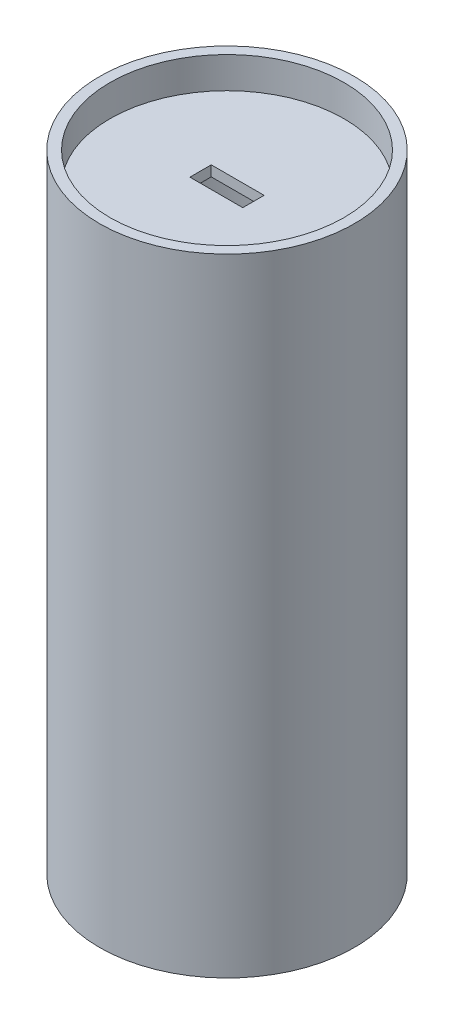
ISO-10303-21;
HEADER;
FILE_DESCRIPTION(('STEP AP214'),'2;1');
FILE_NAME('part.step','',(''),(''),'','','');
FILE_SCHEMA(('AUTOMOTIVE_DESIGN { 1 0 10303 214 1 1 1 1 }'));
ENDSEC;
DATA;
#1=APPLICATION_CONTEXT('core data for automotive mechanical design processes');
#2=APPLICATION_PROTOCOL_DEFINITION('international standard','automotive_design',2000,#1);
#3=PRODUCT_CONTEXT('',#1,'mechanical');
#4=PRODUCT('Part','Part','',(#3));
#5=PRODUCT_RELATED_PRODUCT_CATEGORY('part','',(#4));
#6=PRODUCT_DEFINITION_FORMATION('','',#4);
#7=PRODUCT_DEFINITION_CONTEXT('part definition',#1,'design');
#8=PRODUCT_DEFINITION('design','',#6,#7);
#9=PRODUCT_DEFINITION_SHAPE('','',#8);
#10=(LENGTH_UNIT() NAMED_UNIT(*) SI_UNIT(.MILLI.,.METRE.));
#11=(NAMED_UNIT(*) PLANE_ANGLE_UNIT() SI_UNIT($,.RADIAN.));
#12=(NAMED_UNIT(*) SI_UNIT($,.STERADIAN.) SOLID_ANGLE_UNIT());
#13=UNCERTAINTY_MEASURE_WITH_UNIT(LENGTH_MEASURE(1.E-05),#10,'distance_accuracy_value','');
#14=(GEOMETRIC_REPRESENTATION_CONTEXT(3) GLOBAL_UNCERTAINTY_ASSIGNED_CONTEXT((#13)) GLOBAL_UNIT_ASSIGNED_CONTEXT((#10,
#11,#12)) REPRESENTATION_CONTEXT('',''));
#15=CARTESIAN_POINT('',(0.,0.,0.));
#16=DIRECTION('',(0.,0.,1.));
#17=DIRECTION('',(1.,0.,0.));
#18=AXIS2_PLACEMENT_3D('',#15,#16,#17);
#19=CARTESIAN_POINT('',(0.,300.,0.));
#20=DIRECTION('',(0.,-1.,0.));
#21=DIRECTION('',(0.,0.,-1.));
#22=AXIS2_PLACEMENT_3D('',#19,#20,#21);
#23=CYLINDRICAL_SURFACE('',#22,56.);
#24=CARTESIAN_POINT('',(0.,25.,0.));
#25=DIRECTION('',(0.,1.,0.));
#26=DIRECTION('',(0.,0.,1.));
#27=AXIS2_PLACEMENT_3D('',#24,#25,#26);
#28=CIRCLE('',#27,56.);
#29=CARTESIAN_POINT('',(0.,25.,56.));
#30=VERTEX_POINT('',#29);
#31=EDGE_CURVE('E50',#30,#30,#28,.T.);
#32=ORIENTED_EDGE('',*,*,#31,.F.);
#33=EDGE_LOOP('',(#32));
#34=FACE_BOUND('',#33,.T.);
#35=CARTESIAN_POINT('',(0.,280.,0.));
#36=DIRECTION('',(0.,1.,0.));
#37=DIRECTION('',(0.,0.,1.));
#38=AXIS2_PLACEMENT_3D('',#35,#36,#37);
#39=CIRCLE('',#38,56.);
#40=CARTESIAN_POINT('',(0.,280.,56.));
#41=VERTEX_POINT('',#40);
#42=EDGE_CURVE('E122',#41,#41,#39,.T.);
#43=ORIENTED_EDGE('',*,*,#42,.T.);
#44=EDGE_LOOP('',(#43));
#45=FACE_BOUND('',#44,.T.);
#46=ADVANCED_FACE('F41',(#34,#45),#23,.F.);
#47=CARTESIAN_POINT('',(0.,0.,0.));
#48=DIRECTION('',(0.,1.,0.));
#49=DIRECTION('',(0.,0.,1.));
#50=AXIS2_PLACEMENT_3D('',#47,#48,#49);
#51=CIRCLE('',#50,56.);
#52=CARTESIAN_POINT('',(0.,0.,56.));
#53=VERTEX_POINT('',#52);
#54=EDGE_CURVE('E146',#53,#53,#51,.T.);
#55=ORIENTED_EDGE('',*,*,#54,.F.);
#56=EDGE_LOOP('',(#55));
#57=FACE_BOUND('',#56,.T.);
#58=CARTESIAN_POINT('',(0.,20.,0.));
#59=DIRECTION('',(0.,1.,0.));
#60=DIRECTION('',(0.,0.,1.));
#61=AXIS2_PLACEMENT_3D('',#58,#59,#60);
#62=CIRCLE('',#61,56.);
#63=CARTESIAN_POINT('',(0.,20.,56.));
#64=VERTEX_POINT('',#63);
#65=EDGE_CURVE('E131',#64,#64,#62,.T.);
#66=ORIENTED_EDGE('',*,*,#65,.T.);
#67=EDGE_LOOP('',(#66));
#68=FACE_BOUND('',#67,.T.);
#69=ADVANCED_FACE('F169',(#57,#68),#23,.F.);
#70=CARTESIAN_POINT('',(0.,285.,0.));
#71=DIRECTION('',(0.,1.,0.));
#72=DIRECTION('',(0.,0.,1.));
#73=AXIS2_PLACEMENT_3D('',#70,#71,#72);
#74=CIRCLE('',#73,56.);
#75=CARTESIAN_POINT('',(0.,285.,56.));
#76=VERTEX_POINT('',#75);
#77=EDGE_CURVE('E11',#76,#76,#74,.T.);
#78=ORIENTED_EDGE('',*,*,#77,.F.);
#79=EDGE_LOOP('',(#78));
#80=FACE_BOUND('',#79,.T.);
#81=CARTESIAN_POINT('',(0.,300.,0.));
#82=DIRECTION('',(0.,1.,0.));
#83=DIRECTION('',(0.,0.,1.));
#84=AXIS2_PLACEMENT_3D('',#81,#82,#83);
#85=CIRCLE('',#84,56.);
#86=CARTESIAN_POINT('',(0.,300.,56.));
#87=VERTEX_POINT('',#86);
#88=EDGE_CURVE('E147',#87,#87,#85,.T.);
#89=ORIENTED_EDGE('',*,*,#88,.T.);
#90=EDGE_LOOP('',(#89));
#91=FACE_BOUND('',#90,.T.);
#92=ADVANCED_FACE('F43',(#80,#91),#23,.F.);
#93=CARTESIAN_POINT('',(0.,300.,0.));
#94=DIRECTION('',(0.,-1.,0.));
#95=DIRECTION('',(0.,0.,-1.));
#96=AXIS2_PLACEMENT_3D('',#93,#94,#95);
#97=CYLINDRICAL_SURFACE('',#96,61.);
#98=CARTESIAN_POINT('',(0.,300.,0.));
#99=DIRECTION('',(0.,1.,0.));
#100=DIRECTION('',(0.,0.,1.));
#101=AXIS2_PLACEMENT_3D('',#98,#99,#100);
#102=CIRCLE('',#101,61.);
#103=CARTESIAN_POINT('',(0.,300.,61.));
#104=VERTEX_POINT('',#103);
#105=EDGE_CURVE('E151',#104,#104,#102,.T.);
#106=ORIENTED_EDGE('',*,*,#105,.F.);
#107=EDGE_LOOP('',(#106));
#108=FACE_BOUND('',#107,.T.);
#109=CARTESIAN_POINT('',(0.,0.,0.));
#110=DIRECTION('',(0.,1.,0.));
#111=DIRECTION('',(0.,0.,1.));
#112=AXIS2_PLACEMENT_3D('',#109,#110,#111);
#113=CIRCLE('',#112,61.);
#114=CARTESIAN_POINT('',(0.,0.,61.));
#115=VERTEX_POINT('',#114);
#116=EDGE_CURVE('E152',#115,#115,#113,.T.);
#117=ORIENTED_EDGE('',*,*,#116,.T.);
#118=EDGE_LOOP('',(#117));
#119=FACE_BOUND('',#118,.T.);
#120=ADVANCED_FACE('F201',(#108,#119),#97,.T.);
#121=CARTESIAN_POINT('',(0.,300.,0.));
#122=DIRECTION('',(0.,1.,0.));
#123=DIRECTION('',(0.,0.,1.));
#124=AXIS2_PLACEMENT_3D('',#121,#122,#123);
#125=PLANE('',#124);
#126=ORIENTED_EDGE('',*,*,#88,.F.);
#127=EDGE_LOOP('',(#126));
#128=FACE_BOUND('',#127,.T.);
#129=ORIENTED_EDGE('',*,*,#105,.T.);
#130=EDGE_LOOP('',(#129));
#131=FACE_BOUND('',#130,.T.);
#132=ADVANCED_FACE('F198',(#128,#131),#125,.T.);
#133=CARTESIAN_POINT('',(0.,0.,0.));
#134=DIRECTION('',(0.,1.,0.));
#135=DIRECTION('',(0.,0.,1.));
#136=AXIS2_PLACEMENT_3D('',#133,#134,#135);
#137=PLANE('',#136);
#138=ORIENTED_EDGE('',*,*,#54,.T.);
#139=EDGE_LOOP('',(#138));
#140=FACE_BOUND('',#139,.T.);
#141=ORIENTED_EDGE('',*,*,#116,.F.);
#142=EDGE_LOOP('',(#141));
#143=FACE_BOUND('',#142,.T.);
#144=ADVANCED_FACE('F196',(#140,#143),#137,.F.);
#145=CARTESIAN_POINT('',(0.,20.,0.));
#146=DIRECTION('',(0.,1.,0.));
#147=DIRECTION('',(0.,0.,1.));
#148=AXIS2_PLACEMENT_3D('',#145,#146,#147);
#149=PLANE('',#148);
#150=CARTESIAN_POINT('',(-3.,20.,0.));
#151=DIRECTION('',(0.,-1.,0.));
#152=DIRECTION('',(0.,0.,-1.));
#153=AXIS2_PLACEMENT_3D('',#150,#151,#152);
#154=CIRCLE('',#153,1.5);
#155=CARTESIAN_POINT('',(-3.,20.,-1.5));
#156=VERTEX_POINT('',#155);
#157=EDGE_CURVE('E127',#156,#156,#154,.T.);
#158=ORIENTED_EDGE('',*,*,#157,.F.);
#159=EDGE_LOOP('',(#158));
#160=FACE_BOUND('',#159,.T.);
#161=CARTESIAN_POINT('',(3.,20.,0.));
#162=DIRECTION('',(0.,-1.,0.));
#163=DIRECTION('',(0.,0.,-1.));
#164=AXIS2_PLACEMENT_3D('',#161,#162,#163);
#165=CIRCLE('',#164,1.5);
#166=CARTESIAN_POINT('',(3.,20.,-1.5));
#167=VERTEX_POINT('',#166);
#168=EDGE_CURVE('E136',#167,#167,#165,.T.);
#169=ORIENTED_EDGE('',*,*,#168,.F.);
#170=EDGE_LOOP('',(#169));
#171=FACE_BOUND('',#170,.T.);
#172=ORIENTED_EDGE('',*,*,#65,.F.);
#173=EDGE_LOOP('',(#172));
#174=FACE_BOUND('',#173,.T.);
#175=ADVANCED_FACE('F192',(#160,#171,#174),#149,.F.);
#176=CARTESIAN_POINT('',(0.,25.,0.));
#177=DIRECTION('',(0.,1.,0.));
#178=DIRECTION('',(0.,0.,1.));
#179=AXIS2_PLACEMENT_3D('',#176,#177,#178);
#180=PLANE('',#179);
#181=CARTESIAN_POINT('',(-3.,25.,0.));
#182=DIRECTION('',(0.,1.,0.));
#183=DIRECTION('',(0.,0.,1.));
#184=AXIS2_PLACEMENT_3D('',#181,#182,#183);
#185=CIRCLE('',#184,1.5);
#186=CARTESIAN_POINT('',(-3.,25.,1.5));
#187=VERTEX_POINT('',#186);
#188=EDGE_CURVE('E132',#187,#187,#185,.F.);
#189=ORIENTED_EDGE('',*,*,#188,.T.);
#190=EDGE_LOOP('',(#189));
#191=FACE_BOUND('',#190,.T.);
#192=CARTESIAN_POINT('',(3.,25.,0.));
#193=DIRECTION('',(0.,1.,0.));
#194=DIRECTION('',(0.,0.,1.));
#195=AXIS2_PLACEMENT_3D('',#192,#193,#194);
#196=CIRCLE('',#195,1.5);
#197=CARTESIAN_POINT('',(3.,25.,1.5));
#198=VERTEX_POINT('',#197);
#199=EDGE_CURVE('E126',#198,#198,#196,.F.);
#200=ORIENTED_EDGE('',*,*,#199,.T.);
#201=EDGE_LOOP('',(#200));
#202=FACE_BOUND('',#201,.T.);
#203=ORIENTED_EDGE('',*,*,#31,.T.);
#204=EDGE_LOOP('',(#203));
#205=FACE_BOUND('',#204,.T.);
#206=ADVANCED_FACE('F165',(#191,#202,#205),#180,.T.);
#207=CARTESIAN_POINT('',(3.,300.001,0.));
#208=DIRECTION('',(0.,-1.,0.));
#209=DIRECTION('',(0.,0.,-1.));
#210=AXIS2_PLACEMENT_3D('',#207,#208,#209);
#211=CYLINDRICAL_SURFACE('',#210,1.5);
#212=ORIENTED_EDGE('',*,*,#199,.F.);
#213=EDGE_LOOP('',(#212));
#214=FACE_BOUND('',#213,.T.);
#215=ORIENTED_EDGE('',*,*,#168,.T.);
#216=EDGE_LOOP('',(#215));
#217=FACE_BOUND('',#216,.T.);
#218=ADVANCED_FACE('F182',(#214,#217),#211,.F.);
#219=CARTESIAN_POINT('',(-3.,300.001,0.));
#220=DIRECTION('',(0.,-1.,0.));
#221=DIRECTION('',(0.,0.,-1.));
#222=AXIS2_PLACEMENT_3D('',#219,#220,#221);
#223=CYLINDRICAL_SURFACE('',#222,1.5);
#224=ORIENTED_EDGE('',*,*,#188,.F.);
#225=EDGE_LOOP('',(#224));
#226=FACE_BOUND('',#225,.T.);
#227=ORIENTED_EDGE('',*,*,#157,.T.);
#228=EDGE_LOOP('',(#227));
#229=FACE_BOUND('',#228,.T.);
#230=ADVANCED_FACE('F174',(#226,#229),#223,.F.);
#231=CARTESIAN_POINT('',(0.,280.,0.));
#232=DIRECTION('',(0.,1.,0.));
#233=DIRECTION('',(0.,0.,1.));
#234=AXIS2_PLACEMENT_3D('',#231,#232,#233);
#235=PLANE('',#234);
#236=DIRECTION('',(0.,0.,1.));
#237=VECTOR('',#236,1.);
#238=CARTESIAN_POINT('',(12.6505937068087,280.,-5.1122262239834));
#239=LINE('',#238,#237);
#240=CARTESIAN_POINT('',(12.6505937068087,280.,-5.1122262239834));
#241=VERTEX_POINT('',#240);
#242=CARTESIAN_POINT('',(12.6505937068087,280.,5.1122262239834));
#243=VERTEX_POINT('',#242);
#244=EDGE_CURVE('E99',#241,#243,#239,.T.);
#245=ORIENTED_EDGE('',*,*,#244,.F.);
#246=DIRECTION('',(1.,0.,0.));
#247=VECTOR('',#246,1.);
#248=CARTESIAN_POINT('',(-12.6505937068087,280.,-5.1122262239834));
#249=LINE('',#248,#247);
#250=CARTESIAN_POINT('',(-12.6505937068087,280.,-5.1122262239834));
#251=VERTEX_POINT('',#250);
#252=EDGE_CURVE('E57',#251,#241,#249,.T.);
#253=ORIENTED_EDGE('',*,*,#252,.F.);
#254=DIRECTION('',(0.,0.,-1.));
#255=VECTOR('',#254,1.);
#256=CARTESIAN_POINT('',(-12.6505937068087,280.,-5.1122262239834));
#257=LINE('',#256,#255);
#258=CARTESIAN_POINT('',(-12.6505937068087,280.,5.1122262239834));
#259=VERTEX_POINT('',#258);
#260=EDGE_CURVE('E297',#259,#251,#257,.T.);
#261=ORIENTED_EDGE('',*,*,#260,.F.);
#262=DIRECTION('',(-1.,0.,0.));
#263=VECTOR('',#262,1.);
#264=CARTESIAN_POINT('',(-12.6505937068087,280.,5.1122262239834));
#265=LINE('',#264,#263);
#266=EDGE_CURVE('E294',#243,#259,#265,.T.);
#267=ORIENTED_EDGE('',*,*,#266,.F.);
#268=EDGE_LOOP('',(#245,#253,#261,#267));
#269=FACE_BOUND('',#268,.T.);
#270=ORIENTED_EDGE('',*,*,#42,.F.);
#271=EDGE_LOOP('',(#270));
#272=FACE_BOUND('',#271,.T.);
#273=ADVANCED_FACE('F172',(#269,#272),#235,.F.);
#274=CARTESIAN_POINT('',(0.,285.,0.));
#275=DIRECTION('',(0.,1.,0.));
#276=DIRECTION('',(0.,0.,1.));
#277=AXIS2_PLACEMENT_3D('',#274,#275,#276);
#278=PLANE('',#277);
#279=DIRECTION('',(-1.,0.,0.));
#280=VECTOR('',#279,1.);
#281=CARTESIAN_POINT('',(-12.6505937068087,285.,-5.1122262239834));
#282=LINE('',#281,#280);
#283=CARTESIAN_POINT('',(12.6505937068087,285.,-5.1122262239834));
#284=VERTEX_POINT('',#283);
#285=CARTESIAN_POINT('',(-12.6505937068087,285.,-5.1122262239834));
#286=VERTEX_POINT('',#285);
#287=EDGE_CURVE('E85',#284,#286,#282,.T.);
#288=ORIENTED_EDGE('',*,*,#287,.F.);
#289=DIRECTION('',(0.,0.,-1.));
#290=VECTOR('',#289,1.);
#291=CARTESIAN_POINT('',(12.6505937068087,285.,-5.1122262239834));
#292=LINE('',#291,#290);
#293=CARTESIAN_POINT('',(12.6505937068087,285.,5.1122262239834));
#294=VERTEX_POINT('',#293);
#295=EDGE_CURVE('E94',#294,#284,#292,.T.);
#296=ORIENTED_EDGE('',*,*,#295,.F.);
#297=DIRECTION('',(1.,0.,0.));
#298=VECTOR('',#297,1.);
#299=CARTESIAN_POINT('',(-12.6505937068087,285.,5.1122262239834));
#300=LINE('',#299,#298);
#301=CARTESIAN_POINT('',(-12.6505937068087,285.,5.1122262239834));
#302=VERTEX_POINT('',#301);
#303=EDGE_CURVE('E65',#302,#294,#300,.T.);
#304=ORIENTED_EDGE('',*,*,#303,.F.);
#305=DIRECTION('',(0.,0.,1.));
#306=VECTOR('',#305,1.);
#307=CARTESIAN_POINT('',(-12.6505937068087,285.,-5.1122262239834));
#308=LINE('',#307,#306);
#309=EDGE_CURVE('E104',#286,#302,#308,.T.);
#310=ORIENTED_EDGE('',*,*,#309,.F.);
#311=EDGE_LOOP('',(#288,#296,#304,#310));
#312=FACE_BOUND('',#311,.T.);
#313=ORIENTED_EDGE('',*,*,#77,.T.);
#314=EDGE_LOOP('',(#313));
#315=FACE_BOUND('',#314,.T.);
#316=ADVANCED_FACE('F101',(#312,#315),#278,.T.);
#317=CARTESIAN_POINT('',(-12.6505937068087,-0.000999999999973245,-5.1122262239834));
#318=DIRECTION('',(0.,0.,-1.));
#319=DIRECTION('',(-1.,0.,0.));
#320=AXIS2_PLACEMENT_3D('',#317,#318,#319);
#321=PLANE('',#320);
#322=ORIENTED_EDGE('',*,*,#252,.T.);
#323=DIRECTION('',(0.,1.,0.));
#324=VECTOR('',#323,1.);
#325=CARTESIAN_POINT('',(12.6505937068087,-0.000999999999973245,-5.1122262239834));
#326=LINE('',#325,#324);
#327=EDGE_CURVE('E81',#241,#284,#326,.T.);
#328=ORIENTED_EDGE('',*,*,#327,.T.);
#329=ORIENTED_EDGE('',*,*,#287,.T.);
#330=DIRECTION('',(0.,1.,0.));
#331=VECTOR('',#330,1.);
#332=CARTESIAN_POINT('',(-12.6505937068087,-0.000999999999973245,-5.1122262239834));
#333=LINE('',#332,#331);
#334=EDGE_CURVE('E91',#251,#286,#333,.T.);
#335=ORIENTED_EDGE('',*,*,#334,.F.);
#336=EDGE_LOOP('',(#322,#328,#329,#335));
#337=FACE_BOUND('',#336,.T.);
#338=ADVANCED_FACE('F83',(#337),#321,.F.);
#339=CARTESIAN_POINT('',(-12.6505937068087,-0.000999999999973245,-5.1122262239834));
#340=DIRECTION('',(-1.,0.,0.));
#341=DIRECTION('',(0.,0.,1.));
#342=AXIS2_PLACEMENT_3D('',#339,#340,#341);
#343=PLANE('',#342);
#344=ORIENTED_EDGE('',*,*,#260,.T.);
#345=ORIENTED_EDGE('',*,*,#334,.T.);
#346=ORIENTED_EDGE('',*,*,#309,.T.);
#347=DIRECTION('',(0.,1.,0.));
#348=VECTOR('',#347,1.);
#349=CARTESIAN_POINT('',(-12.6505937068087,-0.000999999999973245,5.1122262239834));
#350=LINE('',#349,#348);
#351=EDGE_CURVE('E115',#259,#302,#350,.T.);
#352=ORIENTED_EDGE('',*,*,#351,.F.);
#353=EDGE_LOOP('',(#344,#345,#346,#352));
#354=FACE_BOUND('',#353,.T.);
#355=ADVANCED_FACE('F263',(#354),#343,.F.);
#356=CARTESIAN_POINT('',(-12.6505937068087,-0.000999999999973245,5.1122262239834));
#357=DIRECTION('',(0.,0.,1.));
#358=DIRECTION('',(1.,0.,0.));
#359=AXIS2_PLACEMENT_3D('',#356,#357,#358);
#360=PLANE('',#359);
#361=ORIENTED_EDGE('',*,*,#266,.T.);
#362=ORIENTED_EDGE('',*,*,#351,.T.);
#363=ORIENTED_EDGE('',*,*,#303,.T.);
#364=DIRECTION('',(0.,1.,0.));
#365=VECTOR('',#364,1.);
#366=CARTESIAN_POINT('',(12.6505937068087,-0.000999999999973245,5.1122262239834));
#367=LINE('',#366,#365);
#368=EDGE_CURVE('E96',#243,#294,#367,.T.);
#369=ORIENTED_EDGE('',*,*,#368,.F.);
#370=EDGE_LOOP('',(#361,#362,#363,#369));
#371=FACE_BOUND('',#370,.T.);
#372=ADVANCED_FACE('F272',(#371),#360,.F.);
#373=CARTESIAN_POINT('',(12.6505937068087,-0.000999999999973245,-5.1122262239834));
#374=DIRECTION('',(1.,0.,0.));
#375=DIRECTION('',(0.,0.,-1.));
#376=AXIS2_PLACEMENT_3D('',#373,#374,#375);
#377=PLANE('',#376);
#378=ORIENTED_EDGE('',*,*,#244,.T.);
#379=ORIENTED_EDGE('',*,*,#368,.T.);
#380=ORIENTED_EDGE('',*,*,#295,.T.);
#381=ORIENTED_EDGE('',*,*,#327,.F.);
#382=EDGE_LOOP('',(#378,#379,#380,#381));
#383=FACE_BOUND('',#382,.T.);
#384=ADVANCED_FACE('F95',(#383),#377,.F.);
#385=CLOSED_SHELL('',(#46,#69,#92,#120,#132,#144,#175,#206,#218,#230,#273,#316,#338,#355,#372,#384));
#386=MANIFOLD_SOLID_BREP('B2',#385);
#387=ADVANCED_BREP_SHAPE_REPRESENTATION('',(#18,#386),#14);
#388=SHAPE_DEFINITION_REPRESENTATION(#9,#387);
ENDSEC;
END-ISO-10303-21;
